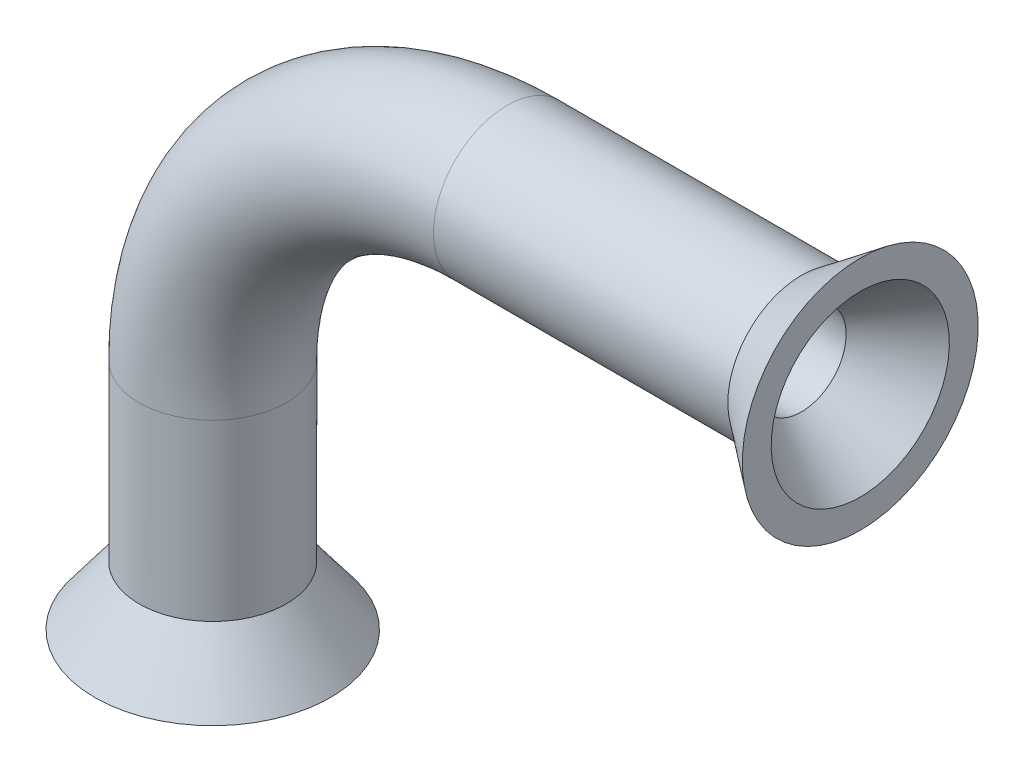
ISO-10303-21;
HEADER;
FILE_DESCRIPTION(('STEP AP214'),'2;1');
FILE_NAME('part.step','',(''),(''),'','','');
FILE_SCHEMA(('AUTOMOTIVE_DESIGN { 1 0 10303 214 1 1 1 1 }'));
ENDSEC;
DATA;
#1=APPLICATION_CONTEXT('core data for automotive mechanical design processes');
#2=APPLICATION_PROTOCOL_DEFINITION('international standard','automotive_design',2000,#1);
#3=PRODUCT_CONTEXT('',#1,'mechanical');
#4=PRODUCT('Part','Part','',(#3));
#5=PRODUCT_RELATED_PRODUCT_CATEGORY('part','',(#4));
#6=PRODUCT_DEFINITION_FORMATION('','',#4);
#7=PRODUCT_DEFINITION_CONTEXT('part definition',#1,'design');
#8=PRODUCT_DEFINITION('design','',#6,#7);
#9=PRODUCT_DEFINITION_SHAPE('','',#8);
#10=(LENGTH_UNIT() NAMED_UNIT(*) SI_UNIT(.MILLI.,.METRE.));
#11=(NAMED_UNIT(*) PLANE_ANGLE_UNIT() SI_UNIT($,.RADIAN.));
#12=(NAMED_UNIT(*) SI_UNIT($,.STERADIAN.) SOLID_ANGLE_UNIT());
#13=UNCERTAINTY_MEASURE_WITH_UNIT(LENGTH_MEASURE(1.E-05),#10,'distance_accuracy_value','');
#14=(GEOMETRIC_REPRESENTATION_CONTEXT(3) GLOBAL_UNCERTAINTY_ASSIGNED_CONTEXT((#13)) GLOBAL_UNIT_ASSIGNED_CONTEXT((#10,
#11,#12)) REPRESENTATION_CONTEXT('',''));
#15=CARTESIAN_POINT('',(0.,0.,0.));
#16=DIRECTION('',(0.,0.,1.));
#17=DIRECTION('',(1.,0.,0.));
#18=AXIS2_PLACEMENT_3D('',#15,#16,#17);
#19=CARTESIAN_POINT('',(0.,0.,0.));
#20=DIRECTION('',(0.,1.,0.));
#21=DIRECTION('',(0.,0.,1.));
#22=AXIS2_PLACEMENT_3D('',#19,#20,#21);
#23=CYLINDRICAL_SURFACE('',#22,3.175);
#24=CARTESIAN_POINT('',(0.,7.5184,0.));
#25=DIRECTION('',(0.,1.,0.));
#26=DIRECTION('',(0.,0.,1.));
#27=AXIS2_PLACEMENT_3D('',#24,#25,#26);
#28=CIRCLE('',#27,3.175);
#29=CARTESIAN_POINT('',(-3.175,7.5184,0.));
#30=VERTEX_POINT('',#29);
#31=EDGE_CURVE('E58',#30,#30,#28,.T.);
#32=ORIENTED_EDGE('',*,*,#31,.F.);
#33=EDGE_LOOP('',(#32));
#34=FACE_BOUND('',#33,.T.);
#35=CARTESIAN_POINT('',(0.,0.,0.));
#36=DIRECTION('',(0.,-1.,0.));
#37=DIRECTION('',(0.,0.,-1.));
#38=AXIS2_PLACEMENT_3D('',#35,#36,#37);
#39=CIRCLE('',#38,3.175);
#40=CARTESIAN_POINT('',(0.,0.,-3.175));
#41=VERTEX_POINT('',#40);
#42=EDGE_CURVE('E68',#41,#41,#39,.T.);
#43=ORIENTED_EDGE('',*,*,#42,.F.);
#44=EDGE_LOOP('',(#43));
#45=FACE_BOUND('',#44,.T.);
#46=ADVANCED_FACE('F37',(#34,#45),#23,.T.);
#47=CARTESIAN_POINT('',(12.7,7.5184,0.));
#48=DIRECTION('',(0.,0.,-1.));
#49=DIRECTION('',(-1.,0.,0.));
#50=AXIS2_PLACEMENT_3D('',#47,#48,#49);
#51=TOROIDAL_SURFACE('',#50,12.7,3.175);
#52=CARTESIAN_POINT('',(12.7,20.2184,0.));
#53=DIRECTION('',(1.,0.,0.));
#54=DIRECTION('',(0.,0.,1.));
#55=AXIS2_PLACEMENT_3D('',#52,#53,#54);
#56=CIRCLE('',#55,3.175);
#57=CARTESIAN_POINT('',(12.7,23.3934,0.));
#58=VERTEX_POINT('',#57);
#59=EDGE_CURVE('E41',#58,#58,#56,.T.);
#60=CARTESIAN_POINT('',(12.7,7.5184,0.));
#61=DIRECTION('',(0.,0.,-1.));
#62=DIRECTION('',(-1.,0.,0.));
#63=AXIS2_PLACEMENT_3D('',#60,#61,#62);
#64=CIRCLE('',#63,15.875);
#65=EDGE_CURVE('',#30,#58,#64,.T.);
#66=ORIENTED_EDGE('',*,*,#31,.T.);
#67=ORIENTED_EDGE('',*,*,#59,.F.);
#68=ORIENTED_EDGE('',*,*,#65,.T.);
#69=ORIENTED_EDGE('',*,*,#65,.F.);
#70=EDGE_LOOP('',(#66,#68,#67,#69));
#71=FACE_BOUND('',#70,.T.);
#72=ADVANCED_FACE('F115',(#71),#51,.T.);
#73=CARTESIAN_POINT('',(12.7,20.2184,0.));
#74=DIRECTION('',(1.,0.,0.));
#75=DIRECTION('',(0.,0.,-1.));
#76=AXIS2_PLACEMENT_3D('',#73,#74,#75);
#77=CYLINDRICAL_SURFACE('',#76,3.175);
#78=CARTESIAN_POINT('',(25.4,20.2184,0.));
#79=DIRECTION('',(1.,0.,0.));
#80=DIRECTION('',(0.,0.,1.));
#81=AXIS2_PLACEMENT_3D('',#78,#79,#80);
#82=CIRCLE('',#81,3.175);
#83=CARTESIAN_POINT('',(25.4,20.2184,3.175));
#84=VERTEX_POINT('',#83);
#85=EDGE_CURVE('E52',#84,#84,#82,.T.);
#86=ORIENTED_EDGE('',*,*,#85,.F.);
#87=EDGE_LOOP('',(#86));
#88=FACE_BOUND('',#87,.T.);
#89=ORIENTED_EDGE('',*,*,#59,.T.);
#90=EDGE_LOOP('',(#89));
#91=FACE_BOUND('',#90,.T.);
#92=ADVANCED_FACE('F39',(#88,#91),#77,.T.);
#93=CARTESIAN_POINT('',(0.,0.,0.));
#94=DIRECTION('',(0.,1.,0.));
#95=DIRECTION('',(0.,0.,1.));
#96=AXIS2_PLACEMENT_3D('',#93,#94,#95);
#97=CYLINDRICAL_SURFACE('',#96,1.9304);
#98=CARTESIAN_POINT('',(0.,7.5184,0.));
#99=DIRECTION('',(0.,1.,0.));
#100=DIRECTION('',(0.,0.,1.));
#101=AXIS2_PLACEMENT_3D('',#98,#99,#100);
#102=CIRCLE('',#101,1.9304);
#103=CARTESIAN_POINT('',(-1.9304,7.5184,0.));
#104=VERTEX_POINT('',#103);
#105=EDGE_CURVE('E46',#104,#104,#102,.F.);
#106=ORIENTED_EDGE('',*,*,#105,.F.);
#107=EDGE_LOOP('',(#106));
#108=FACE_BOUND('',#107,.T.);
#109=CARTESIAN_POINT('',(0.,0.,0.));
#110=DIRECTION('',(0.,-1.,0.));
#111=DIRECTION('',(0.,0.,-1.));
#112=AXIS2_PLACEMENT_3D('',#109,#110,#111);
#113=CIRCLE('',#112,1.9304);
#114=CARTESIAN_POINT('',(0.,0.,-1.9304));
#115=VERTEX_POINT('',#114);
#116=EDGE_CURVE('E73',#115,#115,#113,.T.);
#117=ORIENTED_EDGE('',*,*,#116,.T.);
#118=EDGE_LOOP('',(#117));
#119=FACE_BOUND('',#118,.T.);
#120=ADVANCED_FACE('F114',(#108,#119),#97,.F.);
#121=CARTESIAN_POINT('',(12.7,7.5184,0.));
#122=DIRECTION('',(0.,0.,-1.));
#123=DIRECTION('',(-1.,0.,0.));
#124=AXIS2_PLACEMENT_3D('',#121,#122,#123);
#125=TOROIDAL_SURFACE('',#124,12.7,1.9304);
#126=CARTESIAN_POINT('',(12.7,20.2184,0.));
#127=DIRECTION('',(1.,0.,0.));
#128=DIRECTION('',(0.,0.,1.));
#129=AXIS2_PLACEMENT_3D('',#126,#127,#128);
#130=CIRCLE('',#129,1.9304);
#131=CARTESIAN_POINT('',(12.7,22.1488,0.));
#132=VERTEX_POINT('',#131);
#133=EDGE_CURVE('E10',#132,#132,#130,.F.);
#134=CARTESIAN_POINT('',(12.7,7.5184,0.));
#135=DIRECTION('',(0.,0.,-1.));
#136=DIRECTION('',(-1.,0.,0.));
#137=AXIS2_PLACEMENT_3D('',#134,#135,#136);
#138=CIRCLE('',#137,14.6304);
#139=EDGE_CURVE('',#104,#132,#138,.T.);
#140=ORIENTED_EDGE('',*,*,#105,.T.);
#141=ORIENTED_EDGE('',*,*,#133,.F.);
#142=ORIENTED_EDGE('',*,*,#139,.T.);
#143=ORIENTED_EDGE('',*,*,#139,.F.);
#144=EDGE_LOOP('',(#140,#142,#141,#143));
#145=FACE_BOUND('',#144,.T.);
#146=ADVANCED_FACE('F127',(#145),#125,.F.);
#147=CARTESIAN_POINT('',(12.7,20.2184,0.));
#148=DIRECTION('',(1.,0.,0.));
#149=DIRECTION('',(0.,0.,-1.));
#150=AXIS2_PLACEMENT_3D('',#147,#148,#149);
#151=CYLINDRICAL_SURFACE('',#150,1.9304);
#152=CARTESIAN_POINT('',(25.4,20.2184,0.));
#153=DIRECTION('',(1.,0.,0.));
#154=DIRECTION('',(0.,1.,0.));
#155=AXIS2_PLACEMENT_3D('',#152,#153,#154);
#156=CIRCLE('',#155,1.9304);
#157=CARTESIAN_POINT('',(25.4,22.1488,0.));
#158=VERTEX_POINT('',#157);
#159=EDGE_CURVE('E87',#158,#158,#156,.T.);
#160=ORIENTED_EDGE('',*,*,#159,.T.);
#161=EDGE_LOOP('',(#160));
#162=FACE_BOUND('',#161,.T.);
#163=ORIENTED_EDGE('',*,*,#133,.T.);
#164=EDGE_LOOP('',(#163));
#165=FACE_BOUND('',#164,.T.);
#166=ADVANCED_FACE('F125',(#162,#165),#151,.F.);
#167=CARTESIAN_POINT('',(0.,0.,0.));
#168=DIRECTION('',(0.,-1.,0.));
#169=DIRECTION('',(0.,0.,-1.));
#170=AXIS2_PLACEMENT_3D('',#167,#168,#169);
#171=CONICAL_SURFACE('',#170,3.175,0.645771823237903);
#172=CARTESIAN_POINT('',(0.,-2.54,0.));
#173=DIRECTION('',(0.,-1.,0.));
#174=DIRECTION('',(0.,0.,-1.));
#175=AXIS2_PLACEMENT_3D('',#172,#173,#174);
#176=CIRCLE('',#175,5.0890272872611);
#177=CARTESIAN_POINT('',(0.,-2.54,-5.0890272872611));
#178=VERTEX_POINT('',#177);
#179=EDGE_CURVE('E61',#178,#178,#176,.T.);
#180=ORIENTED_EDGE('',*,*,#179,.F.);
#181=EDGE_LOOP('',(#180));
#182=FACE_BOUND('',#181,.T.);
#183=ORIENTED_EDGE('',*,*,#42,.T.);
#184=EDGE_LOOP('',(#183));
#185=FACE_BOUND('',#184,.T.);
#186=ADVANCED_FACE('F124',(#182,#185),#171,.T.);
#187=CARTESIAN_POINT('',(0.,-2.54,0.));
#188=DIRECTION('',(0.,-1.,0.));
#189=DIRECTION('',(0.,0.,-1.));
#190=AXIS2_PLACEMENT_3D('',#187,#188,#189);
#191=PLANE('',#190);
#192=CARTESIAN_POINT('',(0.,-2.54,0.));
#193=DIRECTION('',(0.,-1.,0.));
#194=DIRECTION('',(0.,0.,-1.));
#195=AXIS2_PLACEMENT_3D('',#192,#193,#194);
#196=CIRCLE('',#195,3.8444272872611);
#197=CARTESIAN_POINT('',(0.,-2.54,-3.8444272872611));
#198=VERTEX_POINT('',#197);
#199=EDGE_CURVE('E79',#198,#198,#196,.T.);
#200=ORIENTED_EDGE('',*,*,#199,.F.);
#201=EDGE_LOOP('',(#200));
#202=FACE_BOUND('',#201,.T.);
#203=ORIENTED_EDGE('',*,*,#179,.T.);
#204=EDGE_LOOP('',(#203));
#205=FACE_BOUND('',#204,.T.);
#206=ADVANCED_FACE('F134',(#202,#205),#191,.T.);
#207=CARTESIAN_POINT('',(0.,-2.54,0.));
#208=DIRECTION('',(0.,-1.,0.));
#209=DIRECTION('',(0.,0.,-1.));
#210=AXIS2_PLACEMENT_3D('',#207,#208,#209);
#211=CONICAL_SURFACE('',#210,3.8444272872611,0.645771823237903);
#212=ORIENTED_EDGE('',*,*,#199,.T.);
#213=EDGE_LOOP('',(#212));
#214=FACE_BOUND('',#213,.T.);
#215=ORIENTED_EDGE('',*,*,#116,.F.);
#216=EDGE_LOOP('',(#215));
#217=FACE_BOUND('',#216,.T.);
#218=ADVANCED_FACE('F108',(#214,#217),#211,.F.);
#219=CARTESIAN_POINT('',(25.4,20.2184,0.));
#220=DIRECTION('',(1.,0.,0.));
#221=DIRECTION('',(0.,1.,0.));
#222=AXIS2_PLACEMENT_3D('',#219,#220,#221);
#223=CONICAL_SURFACE('',#222,3.175,0.645771823237903);
#224=CARTESIAN_POINT('',(27.94,20.2184,0.));
#225=DIRECTION('',(1.,0.,0.));
#226=DIRECTION('',(0.,1.,0.));
#227=AXIS2_PLACEMENT_3D('',#224,#225,#226);
#228=CIRCLE('',#227,5.0890272872611);
#229=CARTESIAN_POINT('',(27.94,25.3074272872611,0.));
#230=VERTEX_POINT('',#229);
#231=EDGE_CURVE('E83',#230,#230,#228,.T.);
#232=ORIENTED_EDGE('',*,*,#231,.F.);
#233=EDGE_LOOP('',(#232));
#234=FACE_BOUND('',#233,.T.);
#235=ORIENTED_EDGE('',*,*,#85,.T.);
#236=EDGE_LOOP('',(#235));
#237=FACE_BOUND('',#236,.T.);
#238=ADVANCED_FACE('F102',(#234,#237),#223,.T.);
#239=CARTESIAN_POINT('',(27.94,20.2184,0.));
#240=DIRECTION('',(1.,0.,0.));
#241=DIRECTION('',(0.,1.,0.));
#242=AXIS2_PLACEMENT_3D('',#239,#240,#241);
#243=PLANE('',#242);
#244=CARTESIAN_POINT('',(27.94,20.2184,0.));
#245=DIRECTION('',(1.,0.,0.));
#246=DIRECTION('',(0.,1.,0.));
#247=AXIS2_PLACEMENT_3D('',#244,#245,#246);
#248=CIRCLE('',#247,3.8444272872611);
#249=CARTESIAN_POINT('',(27.94,24.0628272872611,0.));
#250=VERTEX_POINT('',#249);
#251=EDGE_CURVE('E91',#250,#250,#248,.T.);
#252=ORIENTED_EDGE('',*,*,#251,.F.);
#253=EDGE_LOOP('',(#252));
#254=FACE_BOUND('',#253,.T.);
#255=ORIENTED_EDGE('',*,*,#231,.T.);
#256=EDGE_LOOP('',(#255));
#257=FACE_BOUND('',#256,.T.);
#258=ADVANCED_FACE('F99',(#254,#257),#243,.T.);
#259=CARTESIAN_POINT('',(27.94,20.2184,0.));
#260=DIRECTION('',(1.,0.,0.));
#261=DIRECTION('',(0.,1.,0.));
#262=AXIS2_PLACEMENT_3D('',#259,#260,#261);
#263=CONICAL_SURFACE('',#262,3.8444272872611,0.645771823237903);
#264=ORIENTED_EDGE('',*,*,#251,.T.);
#265=EDGE_LOOP('',(#264));
#266=FACE_BOUND('',#265,.T.);
#267=ORIENTED_EDGE('',*,*,#159,.F.);
#268=EDGE_LOOP('',(#267));
#269=FACE_BOUND('',#268,.T.);
#270=ADVANCED_FACE('F96',(#266,#269),#263,.F.);
#271=CLOSED_SHELL('',(#46,#72,#92,#120,#146,#166,#186,#206,#218,#238,#258,#270));
#272=MANIFOLD_SOLID_BREP('B2',#271);
#273=ADVANCED_BREP_SHAPE_REPRESENTATION('',(#18,#272),#14);
#274=SHAPE_DEFINITION_REPRESENTATION(#9,#273);
ENDSEC;
END-ISO-10303-21;
